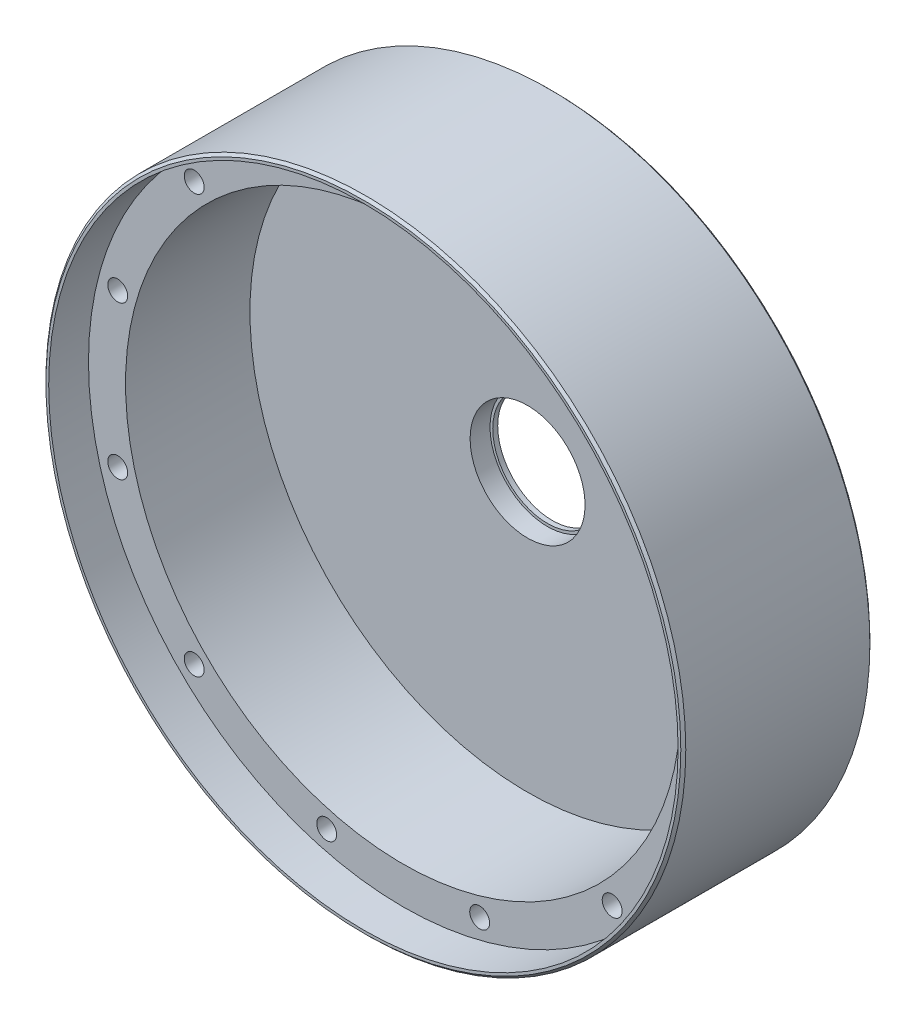
ISO-10303-21;
HEADER;
FILE_DESCRIPTION(('STEP AP214'),'2;1');
FILE_NAME('part.step','',(''),(''),'','','');
FILE_SCHEMA(('AUTOMOTIVE_DESIGN { 1 0 10303 214 1 1 1 1 }'));
ENDSEC;
DATA;
#1=APPLICATION_CONTEXT('core data for automotive mechanical design processes');
#2=APPLICATION_PROTOCOL_DEFINITION('international standard','automotive_design',2000,#1);
#3=PRODUCT_CONTEXT('',#1,'mechanical');
#4=PRODUCT('Part','Part','',(#3));
#5=PRODUCT_RELATED_PRODUCT_CATEGORY('part','',(#4));
#6=PRODUCT_DEFINITION_FORMATION('','',#4);
#7=PRODUCT_DEFINITION_CONTEXT('part definition',#1,'design');
#8=PRODUCT_DEFINITION('design','',#6,#7);
#9=PRODUCT_DEFINITION_SHAPE('','',#8);
#10=(LENGTH_UNIT() NAMED_UNIT(*) SI_UNIT(.MILLI.,.METRE.));
#11=(NAMED_UNIT(*) PLANE_ANGLE_UNIT() SI_UNIT($,.RADIAN.));
#12=(NAMED_UNIT(*) SI_UNIT($,.STERADIAN.) SOLID_ANGLE_UNIT());
#13=UNCERTAINTY_MEASURE_WITH_UNIT(LENGTH_MEASURE(1.E-05),#10,'distance_accuracy_value','');
#14=(GEOMETRIC_REPRESENTATION_CONTEXT(3) GLOBAL_UNCERTAINTY_ASSIGNED_CONTEXT((#13)) GLOBAL_UNIT_ASSIGNED_CONTEXT((#10,
#11,#12)) REPRESENTATION_CONTEXT('',''));
#15=CARTESIAN_POINT('',(0.,0.,0.));
#16=DIRECTION('',(0.,0.,1.));
#17=DIRECTION('',(1.,0.,0.));
#18=AXIS2_PLACEMENT_3D('',#15,#16,#17);
#19=CARTESIAN_POINT('',(57.3759940815707,15.3738512790898,-6.));
#20=DIRECTION('',(0.,0.,1.));
#21=DIRECTION('',(1.,0.,0.));
#22=AXIS2_PLACEMENT_3D('',#19,#20,#21);
#23=CYLINDRICAL_SURFACE('',#22,1.55);
#24=CARTESIAN_POINT('',(57.3759940815707,15.3738512790898,-11.));
#25=DIRECTION('',(0.,0.,-1.));
#26=DIRECTION('',(-1.,0.,0.));
#27=AXIS2_PLACEMENT_3D('',#24,#25,#26);
#28=CIRCLE('',#27,1.55);
#29=CARTESIAN_POINT('',(55.8259940815706,15.3738512790898,-11.));
#30=VERTEX_POINT('',#29);
#31=EDGE_CURVE('E129',#30,#30,#28,.F.);
#32=ORIENTED_EDGE('',*,*,#31,.F.);
#33=EDGE_LOOP('',(#32));
#34=FACE_BOUND('',#33,.T.);
#35=CARTESIAN_POINT('',(57.3759940815707,15.3738512790898,7.));
#36=DIRECTION('',(0.,0.,1.));
#37=DIRECTION('',(1.,0.,0.));
#38=AXIS2_PLACEMENT_3D('',#35,#36,#37);
#39=CIRCLE('',#38,1.55);
#40=CARTESIAN_POINT('',(58.9259940815707,15.3738512790898,7.));
#41=VERTEX_POINT('',#40);
#42=EDGE_CURVE('E63',#41,#41,#39,.F.);
#43=ORIENTED_EDGE('',*,*,#42,.F.);
#44=EDGE_LOOP('',(#43));
#45=FACE_BOUND('',#44,.T.);
#46=ADVANCED_FACE('F41',(#34,#45),#23,.F.);
#47=CARTESIAN_POINT('',(57.3759940815707,-15.3738512790898,-6.));
#48=DIRECTION('',(0.,0.,1.));
#49=DIRECTION('',(1.,0.,0.));
#50=AXIS2_PLACEMENT_3D('',#47,#48,#49);
#51=CYLINDRICAL_SURFACE('',#50,1.55);
#52=CARTESIAN_POINT('',(57.3759940815707,-15.3738512790898,-11.));
#53=DIRECTION('',(0.,0.,-1.));
#54=DIRECTION('',(-1.,0.,0.));
#55=AXIS2_PLACEMENT_3D('',#52,#53,#54);
#56=CIRCLE('',#55,1.55);
#57=CARTESIAN_POINT('',(55.8259940815707,-15.3738512790898,-11.));
#58=VERTEX_POINT('',#57);
#59=EDGE_CURVE('E132',#58,#58,#56,.F.);
#60=ORIENTED_EDGE('',*,*,#59,.F.);
#61=EDGE_LOOP('',(#60));
#62=FACE_BOUND('',#61,.T.);
#63=CARTESIAN_POINT('',(57.3759940815707,-15.3738512790898,7.));
#64=DIRECTION('',(0.,0.,1.));
#65=DIRECTION('',(1.,0.,0.));
#66=AXIS2_PLACEMENT_3D('',#63,#64,#65);
#67=CIRCLE('',#66,1.55);
#68=CARTESIAN_POINT('',(58.9259940815707,-15.3738512790898,7.));
#69=VERTEX_POINT('',#68);
#70=EDGE_CURVE('E67',#69,#69,#67,.F.);
#71=ORIENTED_EDGE('',*,*,#70,.F.);
#72=EDGE_LOOP('',(#71));
#73=FACE_BOUND('',#72,.T.);
#74=ADVANCED_FACE('F269',(#62,#73),#51,.F.);
#75=CARTESIAN_POINT('',(42.0021428024809,-42.002142802481,-6.));
#76=DIRECTION('',(0.,0.,1.));
#77=DIRECTION('',(1.,0.,0.));
#78=AXIS2_PLACEMENT_3D('',#75,#76,#77);
#79=CYLINDRICAL_SURFACE('',#78,1.55);
#80=CARTESIAN_POINT('',(42.0021428024809,-42.002142802481,-11.));
#81=DIRECTION('',(0.,0.,-1.));
#82=DIRECTION('',(-1.,0.,0.));
#83=AXIS2_PLACEMENT_3D('',#80,#81,#82);
#84=CIRCLE('',#83,1.55);
#85=CARTESIAN_POINT('',(40.4521428024809,-42.002142802481,-11.));
#86=VERTEX_POINT('',#85);
#87=EDGE_CURVE('E135',#86,#86,#84,.F.);
#88=ORIENTED_EDGE('',*,*,#87,.F.);
#89=EDGE_LOOP('',(#88));
#90=FACE_BOUND('',#89,.T.);
#91=CARTESIAN_POINT('',(42.0021428024809,-42.002142802481,7.));
#92=DIRECTION('',(0.,0.,1.));
#93=DIRECTION('',(1.,0.,0.));
#94=AXIS2_PLACEMENT_3D('',#91,#92,#93);
#95=CIRCLE('',#94,1.55);
#96=CARTESIAN_POINT('',(43.5521428024809,-42.002142802481,7.));
#97=VERTEX_POINT('',#96);
#98=EDGE_CURVE('E70',#97,#97,#95,.F.);
#99=ORIENTED_EDGE('',*,*,#98,.F.);
#100=EDGE_LOOP('',(#99));
#101=FACE_BOUND('',#100,.T.);
#102=ADVANCED_FACE('F275',(#90,#101),#79,.F.);
#103=CARTESIAN_POINT('',(15.3738512790896,-57.3759940815707,-6.));
#104=DIRECTION('',(0.,0.,1.));
#105=DIRECTION('',(1.,0.,0.));
#106=AXIS2_PLACEMENT_3D('',#103,#104,#105);
#107=CYLINDRICAL_SURFACE('',#106,1.55);
#108=CARTESIAN_POINT('',(15.3738512790896,-57.3759940815707,-11.));
#109=DIRECTION('',(0.,0.,-1.));
#110=DIRECTION('',(-1.,0.,0.));
#111=AXIS2_PLACEMENT_3D('',#108,#109,#110);
#112=CIRCLE('',#111,1.55);
#113=CARTESIAN_POINT('',(13.8238512790896,-57.3759940815707,-11.));
#114=VERTEX_POINT('',#113);
#115=EDGE_CURVE('E126',#114,#114,#112,.F.);
#116=ORIENTED_EDGE('',*,*,#115,.F.);
#117=EDGE_LOOP('',(#116));
#118=FACE_BOUND('',#117,.T.);
#119=CARTESIAN_POINT('',(15.3738512790896,-57.3759940815707,7.));
#120=DIRECTION('',(0.,0.,1.));
#121=DIRECTION('',(1.,0.,0.));
#122=AXIS2_PLACEMENT_3D('',#119,#120,#121);
#123=CIRCLE('',#122,1.55);
#124=CARTESIAN_POINT('',(16.9238512790896,-57.3759940815707,7.));
#125=VERTEX_POINT('',#124);
#126=EDGE_CURVE('E73',#125,#125,#123,.F.);
#127=ORIENTED_EDGE('',*,*,#126,.F.);
#128=EDGE_LOOP('',(#127));
#129=FACE_BOUND('',#128,.T.);
#130=ADVANCED_FACE('F545',(#118,#129),#107,.F.);
#131=CARTESIAN_POINT('',(-15.3738512790899,-57.3759940815706,-6.));
#132=DIRECTION('',(0.,0.,1.));
#133=DIRECTION('',(1.,0.,0.));
#134=AXIS2_PLACEMENT_3D('',#131,#132,#133);
#135=CYLINDRICAL_SURFACE('',#134,1.55000000000001);
#136=CARTESIAN_POINT('',(-15.3738512790899,-57.3759940815706,-11.));
#137=DIRECTION('',(0.,0.,-1.));
#138=DIRECTION('',(-1.,0.,0.));
#139=AXIS2_PLACEMENT_3D('',#136,#137,#138);
#140=CIRCLE('',#139,1.55000000000001);
#141=CARTESIAN_POINT('',(-16.92385127909,-57.3759940815706,-11.));
#142=VERTEX_POINT('',#141);
#143=EDGE_CURVE('E138',#142,#142,#140,.F.);
#144=ORIENTED_EDGE('',*,*,#143,.F.);
#145=EDGE_LOOP('',(#144));
#146=FACE_BOUND('',#145,.T.);
#147=CARTESIAN_POINT('',(-15.3738512790899,-57.3759940815706,7.));
#148=DIRECTION('',(0.,0.,1.));
#149=DIRECTION('',(1.,0.,0.));
#150=AXIS2_PLACEMENT_3D('',#147,#148,#149);
#151=CIRCLE('',#150,1.55000000000001);
#152=CARTESIAN_POINT('',(-13.8238512790899,-57.3759940815706,7.));
#153=VERTEX_POINT('',#152);
#154=EDGE_CURVE('E76',#153,#153,#151,.F.);
#155=ORIENTED_EDGE('',*,*,#154,.F.);
#156=EDGE_LOOP('',(#155));
#157=FACE_BOUND('',#156,.T.);
#158=ADVANCED_FACE('F556',(#146,#157),#135,.F.);
#159=CARTESIAN_POINT('',(-42.0021428024811,-42.0021428024807,-6.));
#160=DIRECTION('',(0.,0.,1.));
#161=DIRECTION('',(1.,0.,0.));
#162=AXIS2_PLACEMENT_3D('',#159,#160,#161);
#163=CYLINDRICAL_SURFACE('',#162,1.55);
#164=CARTESIAN_POINT('',(-42.0021428024811,-42.0021428024807,-11.));
#165=DIRECTION('',(0.,0.,-1.));
#166=DIRECTION('',(-1.,0.,0.));
#167=AXIS2_PLACEMENT_3D('',#164,#165,#166);
#168=CIRCLE('',#167,1.55);
#169=CARTESIAN_POINT('',(-43.5521428024811,-42.0021428024807,-11.));
#170=VERTEX_POINT('',#169);
#171=EDGE_CURVE('E123',#170,#170,#168,.F.);
#172=ORIENTED_EDGE('',*,*,#171,.F.);
#173=EDGE_LOOP('',(#172));
#174=FACE_BOUND('',#173,.T.);
#175=CARTESIAN_POINT('',(-42.0021428024811,-42.0021428024807,7.));
#176=DIRECTION('',(0.,0.,1.));
#177=DIRECTION('',(1.,0.,0.));
#178=AXIS2_PLACEMENT_3D('',#175,#176,#177);
#179=CIRCLE('',#178,1.55);
#180=CARTESIAN_POINT('',(-40.4521428024811,-42.0021428024807,7.));
#181=VERTEX_POINT('',#180);
#182=EDGE_CURVE('E79',#181,#181,#179,.F.);
#183=ORIENTED_EDGE('',*,*,#182,.F.);
#184=EDGE_LOOP('',(#183));
#185=FACE_BOUND('',#184,.T.);
#186=ADVANCED_FACE('F567',(#174,#185),#163,.F.);
#187=CARTESIAN_POINT('',(-57.3759940815707,-15.3738512790894,-6.));
#188=DIRECTION('',(0.,0.,1.));
#189=DIRECTION('',(1.,0.,0.));
#190=AXIS2_PLACEMENT_3D('',#187,#188,#189);
#191=CYLINDRICAL_SURFACE('',#190,1.55000000000001);
#192=CARTESIAN_POINT('',(-57.3759940815707,-15.3738512790894,-11.));
#193=DIRECTION('',(0.,0.,-1.));
#194=DIRECTION('',(-1.,0.,0.));
#195=AXIS2_PLACEMENT_3D('',#192,#193,#194);
#196=CIRCLE('',#195,1.55000000000001);
#197=CARTESIAN_POINT('',(-58.9259940815707,-15.3738512790894,-11.));
#198=VERTEX_POINT('',#197);
#199=EDGE_CURVE('E141',#198,#198,#196,.F.);
#200=ORIENTED_EDGE('',*,*,#199,.F.);
#201=EDGE_LOOP('',(#200));
#202=FACE_BOUND('',#201,.T.);
#203=CARTESIAN_POINT('',(-57.3759940815707,-15.3738512790894,7.));
#204=DIRECTION('',(0.,0.,1.));
#205=DIRECTION('',(1.,0.,0.));
#206=AXIS2_PLACEMENT_3D('',#203,#204,#205);
#207=CIRCLE('',#206,1.55000000000001);
#208=CARTESIAN_POINT('',(-55.8259940815707,-15.3738512790894,7.));
#209=VERTEX_POINT('',#208);
#210=EDGE_CURVE('E82',#209,#209,#207,.F.);
#211=ORIENTED_EDGE('',*,*,#210,.F.);
#212=EDGE_LOOP('',(#211));
#213=FACE_BOUND('',#212,.T.);
#214=ADVANCED_FACE('F578',(#202,#213),#191,.F.);
#215=CARTESIAN_POINT('',(-57.3759940815706,15.3738512790902,-6.));
#216=DIRECTION('',(0.,0.,1.));
#217=DIRECTION('',(1.,0.,0.));
#218=AXIS2_PLACEMENT_3D('',#215,#216,#217);
#219=CYLINDRICAL_SURFACE('',#218,1.55);
#220=CARTESIAN_POINT('',(-57.3759940815706,15.3738512790902,-11.));
#221=DIRECTION('',(0.,0.,-1.));
#222=DIRECTION('',(-1.,0.,0.));
#223=AXIS2_PLACEMENT_3D('',#220,#221,#222);
#224=CIRCLE('',#223,1.55);
#225=CARTESIAN_POINT('',(-58.9259940815706,15.3738512790902,-11.));
#226=VERTEX_POINT('',#225);
#227=EDGE_CURVE('E120',#226,#226,#224,.F.);
#228=ORIENTED_EDGE('',*,*,#227,.F.);
#229=EDGE_LOOP('',(#228));
#230=FACE_BOUND('',#229,.T.);
#231=CARTESIAN_POINT('',(-57.3759940815706,15.3738512790902,7.));
#232=DIRECTION('',(0.,0.,1.));
#233=DIRECTION('',(1.,0.,0.));
#234=AXIS2_PLACEMENT_3D('',#231,#232,#233);
#235=CIRCLE('',#234,1.55);
#236=CARTESIAN_POINT('',(-55.8259940815706,15.3738512790902,7.));
#237=VERTEX_POINT('',#236);
#238=EDGE_CURVE('E85',#237,#237,#235,.F.);
#239=ORIENTED_EDGE('',*,*,#238,.F.);
#240=EDGE_LOOP('',(#239));
#241=FACE_BOUND('',#240,.T.);
#242=ADVANCED_FACE('F589',(#230,#241),#219,.F.);
#243=CARTESIAN_POINT('',(-42.0021428024806,42.0021428024813,-6.));
#244=DIRECTION('',(0.,0.,1.));
#245=DIRECTION('',(1.,0.,0.));
#246=AXIS2_PLACEMENT_3D('',#243,#244,#245);
#247=CYLINDRICAL_SURFACE('',#246,1.55);
#248=CARTESIAN_POINT('',(-42.0021428024806,42.0021428024813,-11.));
#249=DIRECTION('',(0.,0.,-1.));
#250=DIRECTION('',(-1.,0.,0.));
#251=AXIS2_PLACEMENT_3D('',#248,#249,#250);
#252=CIRCLE('',#251,1.55);
#253=CARTESIAN_POINT('',(-43.5521428024806,42.0021428024813,-11.));
#254=VERTEX_POINT('',#253);
#255=EDGE_CURVE('E144',#254,#254,#252,.F.);
#256=ORIENTED_EDGE('',*,*,#255,.F.);
#257=EDGE_LOOP('',(#256));
#258=FACE_BOUND('',#257,.T.);
#259=CARTESIAN_POINT('',(-42.0021428024806,42.0021428024813,7.));
#260=DIRECTION('',(0.,0.,1.));
#261=DIRECTION('',(1.,0.,0.));
#262=AXIS2_PLACEMENT_3D('',#259,#260,#261);
#263=CIRCLE('',#262,1.55);
#264=CARTESIAN_POINT('',(-40.4521428024806,42.0021428024813,7.));
#265=VERTEX_POINT('',#264);
#266=EDGE_CURVE('E88',#265,#265,#263,.F.);
#267=ORIENTED_EDGE('',*,*,#266,.F.);
#268=EDGE_LOOP('',(#267));
#269=FACE_BOUND('',#268,.T.);
#270=ADVANCED_FACE('F600',(#258,#269),#247,.F.);
#271=CARTESIAN_POINT('',(-15.3738512790892,57.3759940815708,-6.));
#272=DIRECTION('',(0.,0.,1.));
#273=DIRECTION('',(1.,0.,0.));
#274=AXIS2_PLACEMENT_3D('',#271,#272,#273);
#275=CYLINDRICAL_SURFACE('',#274,1.55);
#276=CARTESIAN_POINT('',(-15.3738512790892,57.3759940815708,-11.));
#277=DIRECTION('',(0.,0.,-1.));
#278=DIRECTION('',(-1.,0.,0.));
#279=AXIS2_PLACEMENT_3D('',#276,#277,#278);
#280=CIRCLE('',#279,1.55);
#281=CARTESIAN_POINT('',(-16.9238512790892,57.3759940815708,-11.));
#282=VERTEX_POINT('',#281);
#283=EDGE_CURVE('E117',#282,#282,#280,.F.);
#284=ORIENTED_EDGE('',*,*,#283,.F.);
#285=EDGE_LOOP('',(#284));
#286=FACE_BOUND('',#285,.T.);
#287=CARTESIAN_POINT('',(-15.3738512790892,57.3759940815708,7.));
#288=DIRECTION('',(0.,0.,1.));
#289=DIRECTION('',(1.,0.,0.));
#290=AXIS2_PLACEMENT_3D('',#287,#288,#289);
#291=CIRCLE('',#290,1.55);
#292=CARTESIAN_POINT('',(-13.8238512790892,57.3759940815708,7.));
#293=VERTEX_POINT('',#292);
#294=EDGE_CURVE('E91',#293,#293,#291,.F.);
#295=ORIENTED_EDGE('',*,*,#294,.F.);
#296=EDGE_LOOP('',(#295));
#297=FACE_BOUND('',#296,.T.);
#298=ADVANCED_FACE('F611',(#286,#297),#275,.F.);
#299=CARTESIAN_POINT('',(15.3738512790904,57.3759940815705,-6.));
#300=DIRECTION('',(0.,0.,1.));
#301=DIRECTION('',(1.,0.,0.));
#302=AXIS2_PLACEMENT_3D('',#299,#300,#301);
#303=CYLINDRICAL_SURFACE('',#302,1.55);
#304=CARTESIAN_POINT('',(15.3738512790904,57.3759940815705,-11.));
#305=DIRECTION('',(0.,0.,-1.));
#306=DIRECTION('',(-1.,0.,0.));
#307=AXIS2_PLACEMENT_3D('',#304,#305,#306);
#308=CIRCLE('',#307,1.55);
#309=CARTESIAN_POINT('',(13.8238512790904,57.3759940815705,-11.));
#310=VERTEX_POINT('',#309);
#311=EDGE_CURVE('E147',#310,#310,#308,.F.);
#312=ORIENTED_EDGE('',*,*,#311,.F.);
#313=EDGE_LOOP('',(#312));
#314=FACE_BOUND('',#313,.T.);
#315=CARTESIAN_POINT('',(15.3738512790904,57.3759940815705,7.));
#316=DIRECTION('',(0.,0.,1.));
#317=DIRECTION('',(1.,0.,0.));
#318=AXIS2_PLACEMENT_3D('',#315,#316,#317);
#319=CIRCLE('',#318,1.55);
#320=CARTESIAN_POINT('',(16.9238512790904,57.3759940815705,7.));
#321=VERTEX_POINT('',#320);
#322=EDGE_CURVE('E94',#321,#321,#319,.F.);
#323=ORIENTED_EDGE('',*,*,#322,.F.);
#324=EDGE_LOOP('',(#323));
#325=FACE_BOUND('',#324,.T.);
#326=ADVANCED_FACE('F622',(#314,#325),#303,.F.);
#327=CARTESIAN_POINT('',(42.0021428024814,42.0021428024804,-6.));
#328=DIRECTION('',(0.,0.,1.));
#329=DIRECTION('',(1.,0.,0.));
#330=AXIS2_PLACEMENT_3D('',#327,#328,#329);
#331=CYLINDRICAL_SURFACE('',#330,1.55);
#332=CARTESIAN_POINT('',(42.0021428024814,42.0021428024804,-11.));
#333=DIRECTION('',(0.,0.,-1.));
#334=DIRECTION('',(-1.,0.,0.));
#335=AXIS2_PLACEMENT_3D('',#332,#333,#334);
#336=CIRCLE('',#335,1.55);
#337=CARTESIAN_POINT('',(40.4521428024814,42.0021428024804,-11.));
#338=VERTEX_POINT('',#337);
#339=EDGE_CURVE('E112',#338,#338,#336,.F.);
#340=ORIENTED_EDGE('',*,*,#339,.F.);
#341=EDGE_LOOP('',(#340));
#342=FACE_BOUND('',#341,.T.);
#343=CARTESIAN_POINT('',(42.0021428024814,42.0021428024804,7.));
#344=DIRECTION('',(0.,0.,1.));
#345=DIRECTION('',(1.,0.,0.));
#346=AXIS2_PLACEMENT_3D('',#343,#344,#345);
#347=CIRCLE('',#346,1.55);
#348=CARTESIAN_POINT('',(43.5521428024814,42.0021428024804,7.));
#349=VERTEX_POINT('',#348);
#350=EDGE_CURVE('E97',#349,#349,#347,.F.);
#351=ORIENTED_EDGE('',*,*,#350,.F.);
#352=EDGE_LOOP('',(#351));
#353=FACE_BOUND('',#352,.T.);
#354=ADVANCED_FACE('F237',(#342,#353),#331,.F.);
#355=CARTESIAN_POINT('',(0.,0.,19.));
#356=DIRECTION('',(0.,0.,1.));
#357=DIRECTION('',(1.,0.,0.));
#358=AXIS2_PLACEMENT_3D('',#355,#356,#357);
#359=PLANE('',#358);
#360=CARTESIAN_POINT('',(42.0021428024812,-42.0021428024804,19.));
#361=DIRECTION('',(0.,0.,1.));
#362=DIRECTION('',(1.,0.,0.));
#363=AXIS2_PLACEMENT_3D('',#360,#361,#362);
#364=CIRCLE('',#363,2.);
#365=CARTESIAN_POINT('',(44.0021428024812,-42.0021428024804,19.));
#366=VERTEX_POINT('',#365);
#367=EDGE_CURVE('E162',#366,#366,#364,.T.);
#368=ORIENTED_EDGE('',*,*,#367,.F.);
#369=EDGE_LOOP('',(#368));
#370=FACE_BOUND('',#369,.T.);
#371=CARTESIAN_POINT('',(15.3738512790897,-57.3759940815708,19.));
#372=DIRECTION('',(0.,0.,1.));
#373=DIRECTION('',(1.,0.,0.));
#374=AXIS2_PLACEMENT_3D('',#371,#372,#373);
#375=CIRCLE('',#374,2.00000000000124);
#376=CARTESIAN_POINT('',(17.3738512790909,-57.3759940815708,19.));
#377=VERTEX_POINT('',#376);
#378=EDGE_CURVE('E205',#377,#377,#375,.T.);
#379=ORIENTED_EDGE('',*,*,#378,.F.);
#380=EDGE_LOOP('',(#379));
#381=FACE_BOUND('',#380,.T.);
#382=CARTESIAN_POINT('',(-15.3738512790899,-57.3759940815708,19.));
#383=DIRECTION('',(0.,0.,1.));
#384=DIRECTION('',(1.,0.,0.));
#385=AXIS2_PLACEMENT_3D('',#382,#383,#384);
#386=CIRCLE('',#385,2.00000000000205);
#387=CARTESIAN_POINT('',(-13.3738512790878,-57.3759940815708,19.));
#388=VERTEX_POINT('',#387);
#389=EDGE_CURVE('E199',#388,#388,#386,.T.);
#390=ORIENTED_EDGE('',*,*,#389,.F.);
#391=EDGE_LOOP('',(#390));
#392=FACE_BOUND('',#391,.T.);
#393=CARTESIAN_POINT('',(-42.0021428024811,-42.002142802481,19.));
#394=DIRECTION('',(0.,0.,1.));
#395=DIRECTION('',(1.,0.,0.));
#396=AXIS2_PLACEMENT_3D('',#393,#394,#395);
#397=CIRCLE('',#396,2.00000000000268);
#398=CARTESIAN_POINT('',(-40.0021428024785,-42.002142802481,19.));
#399=VERTEX_POINT('',#398);
#400=EDGE_CURVE('E193',#399,#399,#397,.T.);
#401=ORIENTED_EDGE('',*,*,#400,.F.);
#402=EDGE_LOOP('',(#401));
#403=FACE_BOUND('',#402,.T.);
#404=CARTESIAN_POINT('',(-57.3759940815709,-15.3738512790898,19.));
#405=DIRECTION('',(0.,0.,1.));
#406=DIRECTION('',(1.,0.,0.));
#407=AXIS2_PLACEMENT_3D('',#404,#405,#406);
#408=CIRCLE('',#407,2.00000000000299);
#409=CARTESIAN_POINT('',(-55.3759940815679,-15.3738512790898,19.));
#410=VERTEX_POINT('',#409);
#411=EDGE_CURVE('E187',#410,#410,#408,.T.);
#412=ORIENTED_EDGE('',*,*,#411,.F.);
#413=EDGE_LOOP('',(#412));
#414=FACE_BOUND('',#413,.T.);
#415=CARTESIAN_POINT('',(-57.3759940815709,15.3738512790898,19.));
#416=DIRECTION('',(0.,0.,1.));
#417=DIRECTION('',(1.,0.,0.));
#418=AXIS2_PLACEMENT_3D('',#415,#416,#417);
#419=CIRCLE('',#418,2.00000000000288);
#420=CARTESIAN_POINT('',(-55.3759940815681,15.3738512790898,19.));
#421=VERTEX_POINT('',#420);
#422=EDGE_CURVE('E181',#421,#421,#419,.T.);
#423=ORIENTED_EDGE('',*,*,#422,.F.);
#424=EDGE_LOOP('',(#423));
#425=FACE_BOUND('',#424,.T.);
#426=CARTESIAN_POINT('',(-42.0021428024812,42.002142802481,19.));
#427=DIRECTION('',(0.,0.,1.));
#428=DIRECTION('',(1.,0.,0.));
#429=AXIS2_PLACEMENT_3D('',#426,#427,#428);
#430=CIRCLE('',#429,2.00000000000238);
#431=CARTESIAN_POINT('',(-40.0021428024788,42.002142802481,19.));
#432=VERTEX_POINT('',#431);
#433=EDGE_CURVE('E175',#432,#432,#430,.T.);
#434=ORIENTED_EDGE('',*,*,#433,.F.);
#435=EDGE_LOOP('',(#434));
#436=FACE_BOUND('',#435,.T.);
#437=CARTESIAN_POINT('',(-15.3738512790899,57.3759940815708,19.));
#438=DIRECTION('',(0.,0.,1.));
#439=DIRECTION('',(1.,0.,0.));
#440=AXIS2_PLACEMENT_3D('',#437,#438,#439);
#441=CIRCLE('',#440,2.00000000000163);
#442=CARTESIAN_POINT('',(-13.3738512790883,57.3759940815708,19.));
#443=VERTEX_POINT('',#442);
#444=EDGE_CURVE('E168',#443,#443,#441,.T.);
#445=ORIENTED_EDGE('',*,*,#444,.F.);
#446=EDGE_LOOP('',(#445));
#447=FACE_BOUND('',#446,.T.);
#448=CARTESIAN_POINT('',(15.3738512790896,57.3759940815708,19.));
#449=DIRECTION('',(0.,0.,1.));
#450=DIRECTION('',(1.,0.,0.));
#451=AXIS2_PLACEMENT_3D('',#448,#449,#450);
#452=CIRCLE('',#451,2.00000000000084);
#453=CARTESIAN_POINT('',(17.3738512790905,57.3759940815708,19.));
#454=VERTEX_POINT('',#453);
#455=EDGE_CURVE('E169',#454,#454,#452,.T.);
#456=ORIENTED_EDGE('',*,*,#455,.F.);
#457=EDGE_LOOP('',(#456));
#458=FACE_BOUND('',#457,.T.);
#459=CARTESIAN_POINT('',(42.0021428024814,42.0021428024804,19.));
#460=DIRECTION('',(0.,0.,1.));
#461=DIRECTION('',(1.,0.,0.));
#462=AXIS2_PLACEMENT_3D('',#459,#460,#461);
#463=CIRCLE('',#462,2.00000000000001);
#464=CARTESIAN_POINT('',(44.0021428024814,42.0021428024804,19.));
#465=VERTEX_POINT('',#464);
#466=EDGE_CURVE('E222',#465,#465,#463,.T.);
#467=ORIENTED_EDGE('',*,*,#466,.F.);
#468=EDGE_LOOP('',(#467));
#469=FACE_BOUND('',#468,.T.);
#470=CARTESIAN_POINT('',(57.3759940815709,15.373851279089,19.));
#471=DIRECTION('',(0.,0.,1.));
#472=DIRECTION('',(1.,0.,0.));
#473=AXIS2_PLACEMENT_3D('',#470,#471,#472);
#474=CIRCLE('',#473,2.);
#475=CARTESIAN_POINT('',(59.3759940815709,15.373851279089,19.));
#476=VERTEX_POINT('',#475);
#477=EDGE_CURVE('E216',#476,#476,#474,.T.);
#478=ORIENTED_EDGE('',*,*,#477,.F.);
#479=EDGE_LOOP('',(#478));
#480=FACE_BOUND('',#479,.T.);
#481=CARTESIAN_POINT('',(57.3759940815707,-15.3738512790898,19.));
#482=DIRECTION('',(0.,0.,1.));
#483=DIRECTION('',(1.,0.,0.));
#484=AXIS2_PLACEMENT_3D('',#481,#482,#483);
#485=CIRCLE('',#484,2.);
#486=CARTESIAN_POINT('',(59.3759940815707,-15.3738512790898,19.));
#487=VERTEX_POINT('',#486);
#488=EDGE_CURVE('E159',#487,#487,#485,.T.);
#489=ORIENTED_EDGE('',*,*,#488,.F.);
#490=EDGE_LOOP('',(#489));
#491=FACE_BOUND('',#490,.T.);
#492=CARTESIAN_POINT('',(0.,0.,19.));
#493=DIRECTION('',(0.,0.,1.));
#494=DIRECTION('',(1.,0.,0.));
#495=AXIS2_PLACEMENT_3D('',#492,#493,#494);
#496=CIRCLE('',#495,55.8);
#497=CARTESIAN_POINT('',(55.8,0.,19.));
#498=VERTEX_POINT('',#497);
#499=EDGE_CURVE('E109',#498,#498,#496,.T.);
#500=ORIENTED_EDGE('',*,*,#499,.F.);
#501=EDGE_LOOP('',(#500));
#502=FACE_BOUND('',#501,.T.);
#503=CARTESIAN_POINT('',(0.,0.,19.));
#504=DIRECTION('',(0.,0.,1.));
#505=DIRECTION('',(1.,0.,0.));
#506=AXIS2_PLACEMENT_3D('',#503,#504,#505);
#507=CIRCLE('',#506,63.25);
#508=CARTESIAN_POINT('',(63.25,0.,19.));
#509=VERTEX_POINT('',#508);
#510=EDGE_CURVE('E62',#509,#509,#507,.F.);
#511=ORIENTED_EDGE('',*,*,#510,.F.);
#512=EDGE_LOOP('',(#511));
#513=FACE_BOUND('',#512,.T.);
#514=ADVANCED_FACE('F233',(#370,#381,#392,#403,#414,#425,#436,#447,#458,#469,#480,#491,#502,
#513),#359,.T.);
#515=CARTESIAN_POINT('',(0.,0.,-6.));
#516=DIRECTION('',(0.,0.,1.));
#517=DIRECTION('',(1.,0.,0.));
#518=AXIS2_PLACEMENT_3D('',#515,#516,#517);
#519=CYLINDRICAL_SURFACE('',#518,64.3);
#520=CARTESIAN_POINT('',(0.,0.,26.5));
#521=DIRECTION('',(0.,0.,1.));
#522=DIRECTION('',(1.,0.,0.));
#523=AXIS2_PLACEMENT_3D('',#520,#521,#522);
#524=CIRCLE('',#523,64.3);
#525=CARTESIAN_POINT('',(64.3,0.,26.5));
#526=VERTEX_POINT('',#525);
#527=EDGE_CURVE('E49',#526,#526,#524,.F.);
#528=ORIENTED_EDGE('',*,*,#527,.T.);
#529=EDGE_LOOP('',(#528));
#530=FACE_BOUND('',#529,.T.);
#531=CARTESIAN_POINT('',(0.,0.,-10.5));
#532=DIRECTION('',(0.,0.,-1.));
#533=DIRECTION('',(-1.,0.,0.));
#534=AXIS2_PLACEMENT_3D('',#531,#532,#533);
#535=CIRCLE('',#534,64.3);
#536=CARTESIAN_POINT('',(-64.3,0.,-10.5));
#537=VERTEX_POINT('',#536);
#538=EDGE_CURVE('E53',#537,#537,#535,.F.);
#539=ORIENTED_EDGE('',*,*,#538,.T.);
#540=EDGE_LOOP('',(#539));
#541=FACE_BOUND('',#540,.T.);
#542=ADVANCED_FACE('F236',(#530,#541),#519,.T.);
#543=CARTESIAN_POINT('',(0.,0.,-6.));
#544=DIRECTION('',(0.,0.,1.));
#545=DIRECTION('',(1.,0.,0.));
#546=AXIS2_PLACEMENT_3D('',#543,#544,#545);
#547=CYLINDRICAL_SURFACE('',#546,55.8);
#548=CARTESIAN_POINT('',(0.,0.,-6.));
#549=DIRECTION('',(0.,0.,1.));
#550=DIRECTION('',(1.,0.,0.));
#551=AXIS2_PLACEMENT_3D('',#548,#549,#550);
#552=CIRCLE('',#551,55.8);
#553=CARTESIAN_POINT('',(55.8,0.,-6.));
#554=VERTEX_POINT('',#553);
#555=EDGE_CURVE('E103',#554,#554,#552,.T.);
#556=ORIENTED_EDGE('',*,*,#555,.F.);
#557=EDGE_LOOP('',(#556));
#558=FACE_BOUND('',#557,.T.);
#559=ORIENTED_EDGE('',*,*,#499,.T.);
#560=EDGE_LOOP('',(#559));
#561=FACE_BOUND('',#560,.T.);
#562=ADVANCED_FACE('F283',(#558,#561),#547,.F.);
#563=CARTESIAN_POINT('',(0.,0.,-6.));
#564=DIRECTION('',(0.,0.,-1.));
#565=DIRECTION('',(-1.,0.,0.));
#566=AXIS2_PLACEMENT_3D('',#563,#564,#565);
#567=PLANE('',#566);
#568=CARTESIAN_POINT('',(0.,0.,-6.));
#569=DIRECTION('',(0.,0.,-1.));
#570=DIRECTION('',(-1.,0.,0.));
#571=AXIS2_PLACEMENT_3D('',#568,#569,#570);
#572=CIRCLE('',#571,11.55);
#573=CARTESIAN_POINT('',(-11.55,0.,-6.));
#574=VERTEX_POINT('',#573);
#575=EDGE_CURVE('E107',#574,#574,#572,.T.);
#576=ORIENTED_EDGE('',*,*,#575,.T.);
#577=EDGE_LOOP('',(#576));
#578=FACE_BOUND('',#577,.T.);
#579=ORIENTED_EDGE('',*,*,#555,.T.);
#580=EDGE_LOOP('',(#579));
#581=FACE_BOUND('',#580,.T.);
#582=ADVANCED_FACE('F695',(#578,#581),#567,.F.);
#583=CARTESIAN_POINT('',(0.,0.,-11.));
#584=DIRECTION('',(0.,0.,-1.));
#585=DIRECTION('',(-1.,0.,0.));
#586=AXIS2_PLACEMENT_3D('',#583,#584,#585);
#587=PLANE('',#586);
#588=CARTESIAN_POINT('',(0.,0.,-11.));
#589=DIRECTION('',(0.,0.,-1.));
#590=DIRECTION('',(-1.,0.,0.));
#591=AXIS2_PLACEMENT_3D('',#588,#589,#590);
#592=CIRCLE('',#591,63.8);
#593=CARTESIAN_POINT('',(-63.8,0.,-11.));
#594=VERTEX_POINT('',#593);
#595=EDGE_CURVE('E10',#594,#594,#592,.T.);
#596=ORIENTED_EDGE('',*,*,#595,.T.);
#597=EDGE_LOOP('',(#596));
#598=FACE_BOUND('',#597,.T.);
#599=CARTESIAN_POINT('',(0.,0.,-11.));
#600=DIRECTION('',(0.,0.,-1.));
#601=DIRECTION('',(-1.,0.,0.));
#602=AXIS2_PLACEMENT_3D('',#599,#600,#601);
#603=CIRCLE('',#602,11.);
#604=CARTESIAN_POINT('',(-11.,0.,-11.));
#605=VERTEX_POINT('',#604);
#606=EDGE_CURVE('E108',#605,#605,#603,.T.);
#607=ORIENTED_EDGE('',*,*,#606,.F.);
#608=EDGE_LOOP('',(#607));
#609=FACE_BOUND('',#608,.T.);
#610=ORIENTED_EDGE('',*,*,#311,.T.);
#611=EDGE_LOOP('',(#610));
#612=FACE_BOUND('',#611,.T.);
#613=ORIENTED_EDGE('',*,*,#255,.T.);
#614=EDGE_LOOP('',(#613));
#615=FACE_BOUND('',#614,.T.);
#616=ORIENTED_EDGE('',*,*,#199,.T.);
#617=EDGE_LOOP('',(#616));
#618=FACE_BOUND('',#617,.T.);
#619=ORIENTED_EDGE('',*,*,#143,.T.);
#620=EDGE_LOOP('',(#619));
#621=FACE_BOUND('',#620,.T.);
#622=ORIENTED_EDGE('',*,*,#87,.T.);
#623=EDGE_LOOP('',(#622));
#624=FACE_BOUND('',#623,.T.);
#625=ORIENTED_EDGE('',*,*,#59,.T.);
#626=EDGE_LOOP('',(#625));
#627=FACE_BOUND('',#626,.T.);
#628=ORIENTED_EDGE('',*,*,#31,.T.);
#629=EDGE_LOOP('',(#628));
#630=FACE_BOUND('',#629,.T.);
#631=ORIENTED_EDGE('',*,*,#115,.T.);
#632=EDGE_LOOP('',(#631));
#633=FACE_BOUND('',#632,.T.);
#634=ORIENTED_EDGE('',*,*,#171,.T.);
#635=EDGE_LOOP('',(#634));
#636=FACE_BOUND('',#635,.T.);
#637=ORIENTED_EDGE('',*,*,#227,.T.);
#638=EDGE_LOOP('',(#637));
#639=FACE_BOUND('',#638,.T.);
#640=ORIENTED_EDGE('',*,*,#283,.T.);
#641=EDGE_LOOP('',(#640));
#642=FACE_BOUND('',#641,.T.);
#643=ORIENTED_EDGE('',*,*,#339,.T.);
#644=EDGE_LOOP('',(#643));
#645=FACE_BOUND('',#644,.T.);
#646=ADVANCED_FACE('F686',(#598,#609,#612,#615,#618,#621,#624,#627,#630,#633,#636,#639,#642,
#645),#587,.T.);
#647=CARTESIAN_POINT('',(0.,0.,-10.));
#648=DIRECTION('',(0.,0.,1.));
#649=DIRECTION('',(1.,0.,0.));
#650=AXIS2_PLACEMENT_3D('',#647,#648,#649);
#651=CYLINDRICAL_SURFACE('',#650,11.55);
#652=CARTESIAN_POINT('',(0.,0.,-10.));
#653=DIRECTION('',(0.,0.,-1.));
#654=DIRECTION('',(-1.,0.,0.));
#655=AXIS2_PLACEMENT_3D('',#652,#653,#654);
#656=CIRCLE('',#655,11.55);
#657=CARTESIAN_POINT('',(-11.55,0.,-10.));
#658=VERTEX_POINT('',#657);
#659=EDGE_CURVE('E150',#658,#658,#656,.T.);
#660=ORIENTED_EDGE('',*,*,#659,.T.);
#661=EDGE_LOOP('',(#660));
#662=FACE_BOUND('',#661,.T.);
#663=ORIENTED_EDGE('',*,*,#575,.F.);
#664=EDGE_LOOP('',(#663));
#665=FACE_BOUND('',#664,.T.);
#666=ADVANCED_FACE('F677',(#662,#665),#651,.F.);
#667=CARTESIAN_POINT('',(0.,0.,-10.));
#668=DIRECTION('',(0.,0.,-1.));
#669=DIRECTION('',(-1.,0.,0.));
#670=AXIS2_PLACEMENT_3D('',#667,#668,#669);
#671=PLANE('',#670);
#672=CARTESIAN_POINT('',(0.,0.,-10.));
#673=DIRECTION('',(0.,0.,-1.));
#674=DIRECTION('',(-1.,0.,0.));
#675=AXIS2_PLACEMENT_3D('',#672,#673,#674);
#676=CIRCLE('',#675,11.);
#677=CARTESIAN_POINT('',(-11.,0.,-10.));
#678=VERTEX_POINT('',#677);
#679=EDGE_CURVE('E104',#678,#678,#676,.T.);
#680=ORIENTED_EDGE('',*,*,#679,.T.);
#681=EDGE_LOOP('',(#680));
#682=FACE_BOUND('',#681,.T.);
#683=ORIENTED_EDGE('',*,*,#659,.F.);
#684=EDGE_LOOP('',(#683));
#685=FACE_BOUND('',#684,.T.);
#686=ADVANCED_FACE('F668',(#682,#685),#671,.F.);
#687=CARTESIAN_POINT('',(0.,0.,-7.));
#688=DIRECTION('',(0.,0.,-1.));
#689=DIRECTION('',(-1.,0.,0.));
#690=AXIS2_PLACEMENT_3D('',#687,#688,#689);
#691=CYLINDRICAL_SURFACE('',#690,11.);
#692=ORIENTED_EDGE('',*,*,#606,.T.);
#693=EDGE_LOOP('',(#692));
#694=FACE_BOUND('',#693,.T.);
#695=ORIENTED_EDGE('',*,*,#679,.F.);
#696=EDGE_LOOP('',(#695));
#697=FACE_BOUND('',#696,.T.);
#698=ADVANCED_FACE('F265',(#694,#697),#691,.F.);
#699=CARTESIAN_POINT('',(0.,0.,27.));
#700=DIRECTION('',(0.,0.,1.));
#701=DIRECTION('',(1.,0.,0.));
#702=AXIS2_PLACEMENT_3D('',#699,#700,#701);
#703=PLANE('',#702);
#704=CARTESIAN_POINT('',(0.,0.,27.));
#705=DIRECTION('',(0.,0.,1.));
#706=DIRECTION('',(1.,0.,0.));
#707=AXIS2_PLACEMENT_3D('',#704,#705,#706);
#708=CIRCLE('',#707,63.8);
#709=CARTESIAN_POINT('',(63.8,0.,27.));
#710=VERTEX_POINT('',#709);
#711=EDGE_CURVE('E57',#710,#710,#708,.T.);
#712=ORIENTED_EDGE('',*,*,#711,.T.);
#713=EDGE_LOOP('',(#712));
#714=FACE_BOUND('',#713,.T.);
#715=CARTESIAN_POINT('',(0.,0.,27.));
#716=DIRECTION('',(0.,0.,1.));
#717=DIRECTION('',(1.,0.,0.));
#718=AXIS2_PLACEMENT_3D('',#715,#716,#717);
#719=CIRCLE('',#718,63.25);
#720=CARTESIAN_POINT('',(63.25,0.,27.));
#721=VERTEX_POINT('',#720);
#722=EDGE_CURVE('E66',#721,#721,#719,.T.);
#723=ORIENTED_EDGE('',*,*,#722,.F.);
#724=EDGE_LOOP('',(#723));
#725=FACE_BOUND('',#724,.T.);
#726=ADVANCED_FACE('F253',(#714,#725),#703,.T.);
#727=CARTESIAN_POINT('',(0.,0.,27.));
#728=DIRECTION('',(0.,0.,-1.));
#729=DIRECTION('',(-1.,0.,0.));
#730=AXIS2_PLACEMENT_3D('',#727,#728,#729);
#731=CYLINDRICAL_SURFACE('',#730,63.25);
#732=ORIENTED_EDGE('',*,*,#722,.T.);
#733=EDGE_LOOP('',(#732));
#734=FACE_BOUND('',#733,.T.);
#735=ORIENTED_EDGE('',*,*,#510,.T.);
#736=EDGE_LOOP('',(#735));
#737=FACE_BOUND('',#736,.T.);
#738=ADVANCED_FACE('F250',(#734,#737),#731,.F.);
#739=CARTESIAN_POINT('',(42.0021428024814,42.0021428024804,7.));
#740=DIRECTION('',(0.,0.,1.));
#741=DIRECTION('',(1.,0.,0.));
#742=AXIS2_PLACEMENT_3D('',#739,#740,#741);
#743=PLANE('',#742);
#744=CARTESIAN_POINT('',(42.0021428024814,42.0021428024804,7.));
#745=DIRECTION('',(0.,0.,1.));
#746=DIRECTION('',(1.,0.,0.));
#747=AXIS2_PLACEMENT_3D('',#744,#745,#746);
#748=CIRCLE('',#747,2.00000000000001);
#749=CARTESIAN_POINT('',(44.0021428024814,42.0021428024804,7.));
#750=VERTEX_POINT('',#749);
#751=EDGE_CURVE('E219',#750,#750,#748,.T.);
#752=ORIENTED_EDGE('',*,*,#751,.T.);
#753=EDGE_LOOP('',(#752));
#754=FACE_BOUND('',#753,.T.);
#755=ORIENTED_EDGE('',*,*,#350,.T.);
#756=EDGE_LOOP('',(#755));
#757=FACE_BOUND('',#756,.T.);
#758=ADVANCED_FACE('F252',(#754,#757),#743,.T.);
#759=CARTESIAN_POINT('',(42.0021428024814,42.0021428024804,7.));
#760=DIRECTION('',(0.,0.,1.));
#761=DIRECTION('',(1.,0.,0.));
#762=AXIS2_PLACEMENT_3D('',#759,#760,#761);
#763=CYLINDRICAL_SURFACE('',#762,2.00000000000001);
#764=ORIENTED_EDGE('',*,*,#751,.F.);
#765=EDGE_LOOP('',(#764));
#766=FACE_BOUND('',#765,.T.);
#767=ORIENTED_EDGE('',*,*,#466,.T.);
#768=EDGE_LOOP('',(#767));
#769=FACE_BOUND('',#768,.T.);
#770=ADVANCED_FACE('F261',(#766,#769),#763,.F.);
#771=CARTESIAN_POINT('',(15.3738512790896,57.3759940815708,7.));
#772=DIRECTION('',(0.,0.,1.));
#773=DIRECTION('',(1.,0.,0.));
#774=AXIS2_PLACEMENT_3D('',#771,#772,#773);
#775=PLANE('',#774);
#776=CARTESIAN_POINT('',(15.3738512790896,57.3759940815708,7.));
#777=DIRECTION('',(0.,0.,1.));
#778=DIRECTION('',(1.,0.,0.));
#779=AXIS2_PLACEMENT_3D('',#776,#777,#778);
#780=CIRCLE('',#779,2.00000000000084);
#781=CARTESIAN_POINT('',(17.3738512790905,57.3759940815708,7.));
#782=VERTEX_POINT('',#781);
#783=EDGE_CURVE('E225',#782,#782,#780,.T.);
#784=ORIENTED_EDGE('',*,*,#783,.T.);
#785=EDGE_LOOP('',(#784));
#786=FACE_BOUND('',#785,.T.);
#787=ORIENTED_EDGE('',*,*,#322,.T.);
#788=EDGE_LOOP('',(#787));
#789=FACE_BOUND('',#788,.T.);
#790=ADVANCED_FACE('F504',(#786,#789),#775,.T.);
#791=CARTESIAN_POINT('',(15.3738512790896,57.3759940815708,7.));
#792=DIRECTION('',(0.,0.,1.));
#793=DIRECTION('',(1.,0.,0.));
#794=AXIS2_PLACEMENT_3D('',#791,#792,#793);
#795=CYLINDRICAL_SURFACE('',#794,2.00000000000084);
#796=ORIENTED_EDGE('',*,*,#783,.F.);
#797=EDGE_LOOP('',(#796));
#798=FACE_BOUND('',#797,.T.);
#799=ORIENTED_EDGE('',*,*,#455,.T.);
#800=EDGE_LOOP('',(#799));
#801=FACE_BOUND('',#800,.T.);
#802=ADVANCED_FACE('F231',(#798,#801),#795,.F.);
#803=CARTESIAN_POINT('',(-15.3738512790899,57.3759940815708,7.));
#804=DIRECTION('',(0.,0.,1.));
#805=DIRECTION('',(1.,0.,0.));
#806=AXIS2_PLACEMENT_3D('',#803,#804,#805);
#807=PLANE('',#806);
#808=CARTESIAN_POINT('',(-15.3738512790899,57.3759940815708,7.));
#809=DIRECTION('',(0.,0.,1.));
#810=DIRECTION('',(1.,0.,0.));
#811=AXIS2_PLACEMENT_3D('',#808,#809,#810);
#812=CIRCLE('',#811,2.00000000000163);
#813=CARTESIAN_POINT('',(-13.3738512790883,57.3759940815708,7.));
#814=VERTEX_POINT('',#813);
#815=EDGE_CURVE('E165',#814,#814,#812,.T.);
#816=ORIENTED_EDGE('',*,*,#815,.T.);
#817=EDGE_LOOP('',(#816));
#818=FACE_BOUND('',#817,.T.);
#819=ORIENTED_EDGE('',*,*,#294,.T.);
#820=EDGE_LOOP('',(#819));
#821=FACE_BOUND('',#820,.T.);
#822=ADVANCED_FACE('F373',(#818,#821),#807,.T.);
#823=CARTESIAN_POINT('',(-15.3738512790899,57.3759940815708,7.));
#824=DIRECTION('',(0.,0.,1.));
#825=DIRECTION('',(1.,0.,0.));
#826=AXIS2_PLACEMENT_3D('',#823,#824,#825);
#827=CYLINDRICAL_SURFACE('',#826,2.00000000000163);
#828=ORIENTED_EDGE('',*,*,#815,.F.);
#829=EDGE_LOOP('',(#828));
#830=FACE_BOUND('',#829,.T.);
#831=ORIENTED_EDGE('',*,*,#444,.T.);
#832=EDGE_LOOP('',(#831));
#833=FACE_BOUND('',#832,.T.);
#834=ADVANCED_FACE('F369',(#830,#833),#827,.F.);
#835=CARTESIAN_POINT('',(-42.0021428024812,42.002142802481,7.));
#836=DIRECTION('',(0.,0.,1.));
#837=DIRECTION('',(1.,0.,0.));
#838=AXIS2_PLACEMENT_3D('',#835,#836,#837);
#839=PLANE('',#838);
#840=CARTESIAN_POINT('',(-42.0021428024812,42.002142802481,7.));
#841=DIRECTION('',(0.,0.,1.));
#842=DIRECTION('',(1.,0.,0.));
#843=AXIS2_PLACEMENT_3D('',#840,#841,#842);
#844=CIRCLE('',#843,2.00000000000238);
#845=CARTESIAN_POINT('',(-40.0021428024788,42.002142802481,7.));
#846=VERTEX_POINT('',#845);
#847=EDGE_CURVE('E172',#846,#846,#844,.T.);
#848=ORIENTED_EDGE('',*,*,#847,.T.);
#849=EDGE_LOOP('',(#848));
#850=FACE_BOUND('',#849,.T.);
#851=ORIENTED_EDGE('',*,*,#266,.T.);
#852=EDGE_LOOP('',(#851));
#853=FACE_BOUND('',#852,.T.);
#854=ADVANCED_FACE('F365',(#850,#853),#839,.T.);
#855=CARTESIAN_POINT('',(-42.0021428024812,42.002142802481,7.));
#856=DIRECTION('',(0.,0.,1.));
#857=DIRECTION('',(1.,0.,0.));
#858=AXIS2_PLACEMENT_3D('',#855,#856,#857);
#859=CYLINDRICAL_SURFACE('',#858,2.00000000000238);
#860=ORIENTED_EDGE('',*,*,#847,.F.);
#861=EDGE_LOOP('',(#860));
#862=FACE_BOUND('',#861,.T.);
#863=ORIENTED_EDGE('',*,*,#433,.T.);
#864=EDGE_LOOP('',(#863));
#865=FACE_BOUND('',#864,.T.);
#866=ADVANCED_FACE('F361',(#862,#865),#859,.F.);
#867=CARTESIAN_POINT('',(-57.3759940815709,15.3738512790898,7.));
#868=DIRECTION('',(0.,0.,1.));
#869=DIRECTION('',(1.,0.,0.));
#870=AXIS2_PLACEMENT_3D('',#867,#868,#869);
#871=PLANE('',#870);
#872=CARTESIAN_POINT('',(-57.3759940815709,15.3738512790898,7.));
#873=DIRECTION('',(0.,0.,1.));
#874=DIRECTION('',(1.,0.,0.));
#875=AXIS2_PLACEMENT_3D('',#872,#873,#874);
#876=CIRCLE('',#875,2.00000000000288);
#877=CARTESIAN_POINT('',(-55.3759940815681,15.3738512790898,7.));
#878=VERTEX_POINT('',#877);
#879=EDGE_CURVE('E178',#878,#878,#876,.T.);
#880=ORIENTED_EDGE('',*,*,#879,.T.);
#881=EDGE_LOOP('',(#880));
#882=FACE_BOUND('',#881,.T.);
#883=ORIENTED_EDGE('',*,*,#238,.T.);
#884=EDGE_LOOP('',(#883));
#885=FACE_BOUND('',#884,.T.);
#886=ADVANCED_FACE('F357',(#882,#885),#871,.T.);
#887=CARTESIAN_POINT('',(-57.3759940815709,15.3738512790898,7.));
#888=DIRECTION('',(0.,0.,1.));
#889=DIRECTION('',(1.,0.,0.));
#890=AXIS2_PLACEMENT_3D('',#887,#888,#889);
#891=CYLINDRICAL_SURFACE('',#890,2.00000000000288);
#892=ORIENTED_EDGE('',*,*,#879,.F.);
#893=EDGE_LOOP('',(#892));
#894=FACE_BOUND('',#893,.T.);
#895=ORIENTED_EDGE('',*,*,#422,.T.);
#896=EDGE_LOOP('',(#895));
#897=FACE_BOUND('',#896,.T.);
#898=ADVANCED_FACE('F353',(#894,#897),#891,.F.);
#899=CARTESIAN_POINT('',(-57.3759940815709,-15.3738512790898,7.));
#900=DIRECTION('',(0.,0.,1.));
#901=DIRECTION('',(1.,0.,0.));
#902=AXIS2_PLACEMENT_3D('',#899,#900,#901);
#903=PLANE('',#902);
#904=CARTESIAN_POINT('',(-57.3759940815709,-15.3738512790898,7.));
#905=DIRECTION('',(0.,0.,1.));
#906=DIRECTION('',(1.,0.,0.));
#907=AXIS2_PLACEMENT_3D('',#904,#905,#906);
#908=CIRCLE('',#907,2.00000000000299);
#909=CARTESIAN_POINT('',(-55.3759940815679,-15.3738512790898,7.));
#910=VERTEX_POINT('',#909);
#911=EDGE_CURVE('E184',#910,#910,#908,.T.);
#912=ORIENTED_EDGE('',*,*,#911,.T.);
#913=EDGE_LOOP('',(#912));
#914=FACE_BOUND('',#913,.T.);
#915=ORIENTED_EDGE('',*,*,#210,.T.);
#916=EDGE_LOOP('',(#915));
#917=FACE_BOUND('',#916,.T.);
#918=ADVANCED_FACE('F349',(#914,#917),#903,.T.);
#919=CARTESIAN_POINT('',(-57.3759940815709,-15.3738512790898,7.));
#920=DIRECTION('',(0.,0.,1.));
#921=DIRECTION('',(1.,0.,0.));
#922=AXIS2_PLACEMENT_3D('',#919,#920,#921);
#923=CYLINDRICAL_SURFACE('',#922,2.00000000000299);
#924=ORIENTED_EDGE('',*,*,#911,.F.);
#925=EDGE_LOOP('',(#924));
#926=FACE_BOUND('',#925,.T.);
#927=ORIENTED_EDGE('',*,*,#411,.T.);
#928=EDGE_LOOP('',(#927));
#929=FACE_BOUND('',#928,.T.);
#930=ADVANCED_FACE('F345',(#926,#929),#923,.F.);
#931=CARTESIAN_POINT('',(-42.0021428024811,-42.002142802481,7.));
#932=DIRECTION('',(0.,0.,1.));
#933=DIRECTION('',(1.,0.,0.));
#934=AXIS2_PLACEMENT_3D('',#931,#932,#933);
#935=PLANE('',#934);
#936=CARTESIAN_POINT('',(-42.0021428024811,-42.002142802481,7.));
#937=DIRECTION('',(0.,0.,1.));
#938=DIRECTION('',(1.,0.,0.));
#939=AXIS2_PLACEMENT_3D('',#936,#937,#938);
#940=CIRCLE('',#939,2.00000000000268);
#941=CARTESIAN_POINT('',(-40.0021428024785,-42.002142802481,7.));
#942=VERTEX_POINT('',#941);
#943=EDGE_CURVE('E190',#942,#942,#940,.T.);
#944=ORIENTED_EDGE('',*,*,#943,.T.);
#945=EDGE_LOOP('',(#944));
#946=FACE_BOUND('',#945,.T.);
#947=ORIENTED_EDGE('',*,*,#182,.T.);
#948=EDGE_LOOP('',(#947));
#949=FACE_BOUND('',#948,.T.);
#950=ADVANCED_FACE('F341',(#946,#949),#935,.T.);
#951=CARTESIAN_POINT('',(-42.0021428024811,-42.002142802481,7.));
#952=DIRECTION('',(0.,0.,1.));
#953=DIRECTION('',(1.,0.,0.));
#954=AXIS2_PLACEMENT_3D('',#951,#952,#953);
#955=CYLINDRICAL_SURFACE('',#954,2.00000000000268);
#956=ORIENTED_EDGE('',*,*,#943,.F.);
#957=EDGE_LOOP('',(#956));
#958=FACE_BOUND('',#957,.T.);
#959=ORIENTED_EDGE('',*,*,#400,.T.);
#960=EDGE_LOOP('',(#959));
#961=FACE_BOUND('',#960,.T.);
#962=ADVANCED_FACE('F337',(#958,#961),#955,.F.);
#963=CARTESIAN_POINT('',(-15.3738512790899,-57.3759940815708,7.));
#964=DIRECTION('',(0.,0.,1.));
#965=DIRECTION('',(1.,0.,0.));
#966=AXIS2_PLACEMENT_3D('',#963,#964,#965);
#967=PLANE('',#966);
#968=CARTESIAN_POINT('',(-15.3738512790899,-57.3759940815708,7.));
#969=DIRECTION('',(0.,0.,1.));
#970=DIRECTION('',(1.,0.,0.));
#971=AXIS2_PLACEMENT_3D('',#968,#969,#970);
#972=CIRCLE('',#971,2.00000000000205);
#973=CARTESIAN_POINT('',(-13.3738512790878,-57.3759940815708,7.));
#974=VERTEX_POINT('',#973);
#975=EDGE_CURVE('E196',#974,#974,#972,.T.);
#976=ORIENTED_EDGE('',*,*,#975,.T.);
#977=EDGE_LOOP('',(#976));
#978=FACE_BOUND('',#977,.T.);
#979=ORIENTED_EDGE('',*,*,#154,.T.);
#980=EDGE_LOOP('',(#979));
#981=FACE_BOUND('',#980,.T.);
#982=ADVANCED_FACE('F333',(#978,#981),#967,.T.);
#983=CARTESIAN_POINT('',(-15.3738512790899,-57.3759940815708,7.));
#984=DIRECTION('',(0.,0.,1.));
#985=DIRECTION('',(1.,0.,0.));
#986=AXIS2_PLACEMENT_3D('',#983,#984,#985);
#987=CYLINDRICAL_SURFACE('',#986,2.00000000000205);
#988=ORIENTED_EDGE('',*,*,#975,.F.);
#989=EDGE_LOOP('',(#988));
#990=FACE_BOUND('',#989,.T.);
#991=ORIENTED_EDGE('',*,*,#389,.T.);
#992=EDGE_LOOP('',(#991));
#993=FACE_BOUND('',#992,.T.);
#994=ADVANCED_FACE('F329',(#990,#993),#987,.F.);
#995=CARTESIAN_POINT('',(15.3738512790897,-57.3759940815708,7.));
#996=DIRECTION('',(0.,0.,1.));
#997=DIRECTION('',(1.,0.,0.));
#998=AXIS2_PLACEMENT_3D('',#995,#996,#997);
#999=PLANE('',#998);
#1000=CARTESIAN_POINT('',(15.3738512790897,-57.3759940815708,7.));
#1001=DIRECTION('',(0.,0.,1.));
#1002=DIRECTION('',(1.,0.,0.));
#1003=AXIS2_PLACEMENT_3D('',#1000,#1001,#1002);
#1004=CIRCLE('',#1003,2.00000000000124);
#1005=CARTESIAN_POINT('',(17.3738512790909,-57.3759940815708,7.));
#1006=VERTEX_POINT('',#1005);
#1007=EDGE_CURVE('E202',#1006,#1006,#1004,.T.);
#1008=ORIENTED_EDGE('',*,*,#1007,.T.);
#1009=EDGE_LOOP('',(#1008));
#1010=FACE_BOUND('',#1009,.T.);
#1011=ORIENTED_EDGE('',*,*,#126,.T.);
#1012=EDGE_LOOP('',(#1011));
#1013=FACE_BOUND('',#1012,.T.);
#1014=ADVANCED_FACE('F325',(#1010,#1013),#999,.T.);
#1015=CARTESIAN_POINT('',(15.3738512790897,-57.3759940815708,7.));
#1016=DIRECTION('',(0.,0.,1.));
#1017=DIRECTION('',(1.,0.,0.));
#1018=AXIS2_PLACEMENT_3D('',#1015,#1016,#1017);
#1019=CYLINDRICAL_SURFACE('',#1018,2.00000000000124);
#1020=ORIENTED_EDGE('',*,*,#1007,.F.);
#1021=EDGE_LOOP('',(#1020));
#1022=FACE_BOUND('',#1021,.T.);
#1023=ORIENTED_EDGE('',*,*,#378,.T.);
#1024=EDGE_LOOP('',(#1023));
#1025=FACE_BOUND('',#1024,.T.);
#1026=ADVANCED_FACE('F321',(#1022,#1025),#1019,.F.);
#1027=CARTESIAN_POINT('',(42.0021428024812,-42.0021428024804,7.));
#1028=DIRECTION('',(0.,0.,1.));
#1029=DIRECTION('',(1.,0.,0.));
#1030=AXIS2_PLACEMENT_3D('',#1027,#1028,#1029);
#1031=PLANE('',#1030);
#1032=CARTESIAN_POINT('',(42.0021428024812,-42.0021428024804,7.));
#1033=DIRECTION('',(0.,0.,1.));
#1034=DIRECTION('',(1.,0.,0.));
#1035=AXIS2_PLACEMENT_3D('',#1032,#1033,#1034);
#1036=CIRCLE('',#1035,2.);
#1037=CARTESIAN_POINT('',(44.0021428024812,-42.0021428024804,7.));
#1038=VERTEX_POINT('',#1037);
#1039=EDGE_CURVE('E208',#1038,#1038,#1036,.T.);
#1040=ORIENTED_EDGE('',*,*,#1039,.T.);
#1041=EDGE_LOOP('',(#1040));
#1042=FACE_BOUND('',#1041,.T.);
#1043=ORIENTED_EDGE('',*,*,#98,.T.);
#1044=EDGE_LOOP('',(#1043));
#1045=FACE_BOUND('',#1044,.T.);
#1046=ADVANCED_FACE('F317',(#1042,#1045),#1031,.T.);
#1047=CARTESIAN_POINT('',(42.0021428024812,-42.0021428024804,7.));
#1048=DIRECTION('',(0.,0.,1.));
#1049=DIRECTION('',(1.,0.,0.));
#1050=AXIS2_PLACEMENT_3D('',#1047,#1048,#1049);
#1051=CYLINDRICAL_SURFACE('',#1050,2.);
#1052=ORIENTED_EDGE('',*,*,#1039,.F.);
#1053=EDGE_LOOP('',(#1052));
#1054=FACE_BOUND('',#1053,.T.);
#1055=ORIENTED_EDGE('',*,*,#367,.T.);
#1056=EDGE_LOOP('',(#1055));
#1057=FACE_BOUND('',#1056,.T.);
#1058=ADVANCED_FACE('F313',(#1054,#1057),#1051,.F.);
#1059=CARTESIAN_POINT('',(57.3759940815707,-15.3738512790898,7.));
#1060=DIRECTION('',(0.,0.,1.));
#1061=DIRECTION('',(1.,0.,0.));
#1062=AXIS2_PLACEMENT_3D('',#1059,#1060,#1061);
#1063=PLANE('',#1062);
#1064=CARTESIAN_POINT('',(57.3759940815707,-15.3738512790898,7.));
#1065=DIRECTION('',(0.,0.,1.));
#1066=DIRECTION('',(1.,0.,0.));
#1067=AXIS2_PLACEMENT_3D('',#1064,#1065,#1066);
#1068=CIRCLE('',#1067,2.);
#1069=CARTESIAN_POINT('',(59.3759940815707,-15.3738512790898,7.));
#1070=VERTEX_POINT('',#1069);
#1071=EDGE_CURVE('E100',#1070,#1070,#1068,.T.);
#1072=ORIENTED_EDGE('',*,*,#1071,.T.);
#1073=EDGE_LOOP('',(#1072));
#1074=FACE_BOUND('',#1073,.T.);
#1075=ORIENTED_EDGE('',*,*,#70,.T.);
#1076=EDGE_LOOP('',(#1075));
#1077=FACE_BOUND('',#1076,.T.);
#1078=ADVANCED_FACE('F316',(#1074,#1077),#1063,.T.);
#1079=CARTESIAN_POINT('',(57.3759940815707,-15.3738512790898,7.));
#1080=DIRECTION('',(0.,0.,1.));
#1081=DIRECTION('',(1.,0.,0.));
#1082=AXIS2_PLACEMENT_3D('',#1079,#1080,#1081);
#1083=CYLINDRICAL_SURFACE('',#1082,2.);
#1084=ORIENTED_EDGE('',*,*,#1071,.F.);
#1085=EDGE_LOOP('',(#1084));
#1086=FACE_BOUND('',#1085,.T.);
#1087=ORIENTED_EDGE('',*,*,#488,.T.);
#1088=EDGE_LOOP('',(#1087));
#1089=FACE_BOUND('',#1088,.T.);
#1090=ADVANCED_FACE('F306',(#1086,#1089),#1083,.F.);
#1091=CARTESIAN_POINT('',(57.3759940815709,15.373851279089,7.));
#1092=DIRECTION('',(0.,0.,1.));
#1093=DIRECTION('',(1.,0.,0.));
#1094=AXIS2_PLACEMENT_3D('',#1091,#1092,#1093);
#1095=PLANE('',#1094);
#1096=CARTESIAN_POINT('',(57.3759940815709,15.373851279089,7.));
#1097=DIRECTION('',(0.,0.,1.));
#1098=DIRECTION('',(1.,0.,0.));
#1099=AXIS2_PLACEMENT_3D('',#1096,#1097,#1098);
#1100=CIRCLE('',#1099,2.);
#1101=CARTESIAN_POINT('',(59.3759940815709,15.373851279089,7.));
#1102=VERTEX_POINT('',#1101);
#1103=EDGE_CURVE('E213',#1102,#1102,#1100,.T.);
#1104=ORIENTED_EDGE('',*,*,#1103,.T.);
#1105=EDGE_LOOP('',(#1104));
#1106=FACE_BOUND('',#1105,.T.);
#1107=ORIENTED_EDGE('',*,*,#42,.T.);
#1108=EDGE_LOOP('',(#1107));
#1109=FACE_BOUND('',#1108,.T.);
#1110=ADVANCED_FACE('F296',(#1106,#1109),#1095,.T.);
#1111=CARTESIAN_POINT('',(57.3759940815709,15.373851279089,7.));
#1112=DIRECTION('',(0.,0.,1.));
#1113=DIRECTION('',(1.,0.,0.));
#1114=AXIS2_PLACEMENT_3D('',#1111,#1112,#1113);
#1115=CYLINDRICAL_SURFACE('',#1114,2.);
#1116=ORIENTED_EDGE('',*,*,#1103,.F.);
#1117=EDGE_LOOP('',(#1116));
#1118=FACE_BOUND('',#1117,.T.);
#1119=ORIENTED_EDGE('',*,*,#477,.T.);
#1120=EDGE_LOOP('',(#1119));
#1121=FACE_BOUND('',#1120,.T.);
#1122=ADVANCED_FACE('F289',(#1118,#1121),#1115,.F.);
#1123=CARTESIAN_POINT('',(0.,0.,27.));
#1124=DIRECTION('',(0.,0.,-1.));
#1125=DIRECTION('',(-1.,0.,0.));
#1126=AXIS2_PLACEMENT_3D('',#1123,#1124,#1125);
#1127=CONICAL_SURFACE('',#1126,63.8,0.785398163397448);
#1128=ORIENTED_EDGE('',*,*,#527,.F.);
#1129=EDGE_LOOP('',(#1128));
#1130=FACE_BOUND('',#1129,.T.);
#1131=ORIENTED_EDGE('',*,*,#711,.F.);
#1132=EDGE_LOOP('',(#1131));
#1133=FACE_BOUND('',#1132,.T.);
#1134=ADVANCED_FACE('F285',(#1130,#1133),#1127,.T.);
#1135=CARTESIAN_POINT('',(0.,0.,-11.));
#1136=DIRECTION('',(0.,0.,1.));
#1137=DIRECTION('',(1.,0.,0.));
#1138=AXIS2_PLACEMENT_3D('',#1135,#1136,#1137);
#1139=CONICAL_SURFACE('',#1138,63.8,0.785398163397448);
#1140=ORIENTED_EDGE('',*,*,#538,.F.);
#1141=EDGE_LOOP('',(#1140));
#1142=FACE_BOUND('',#1141,.T.);
#1143=ORIENTED_EDGE('',*,*,#595,.F.);
#1144=EDGE_LOOP('',(#1143));
#1145=FACE_BOUND('',#1144,.T.);
#1146=ADVANCED_FACE('F44',(#1142,#1145),#1139,.T.);
#1147=CLOSED_SHELL('',(#46,#74,#102,#130,#158,#186,#214,#242,#270,#298,#326,#354,#514,#542,#562,
#582,#646,#666,#686,#698,#726,#738,#758,#770,#790,#802,#822,#834,#854,#866,#886,#898,#918,#930,
#950,#962,#982,#994,#1014,#1026,#1046,#1058,#1078,#1090,#1110,#1122,#1134,#1146));
#1148=MANIFOLD_SOLID_BREP('B2',#1147);
#1149=ADVANCED_BREP_SHAPE_REPRESENTATION('',(#18,#1148),#14);
#1150=SHAPE_DEFINITION_REPRESENTATION(#9,#1149);
ENDSEC;
END-ISO-10303-21;
